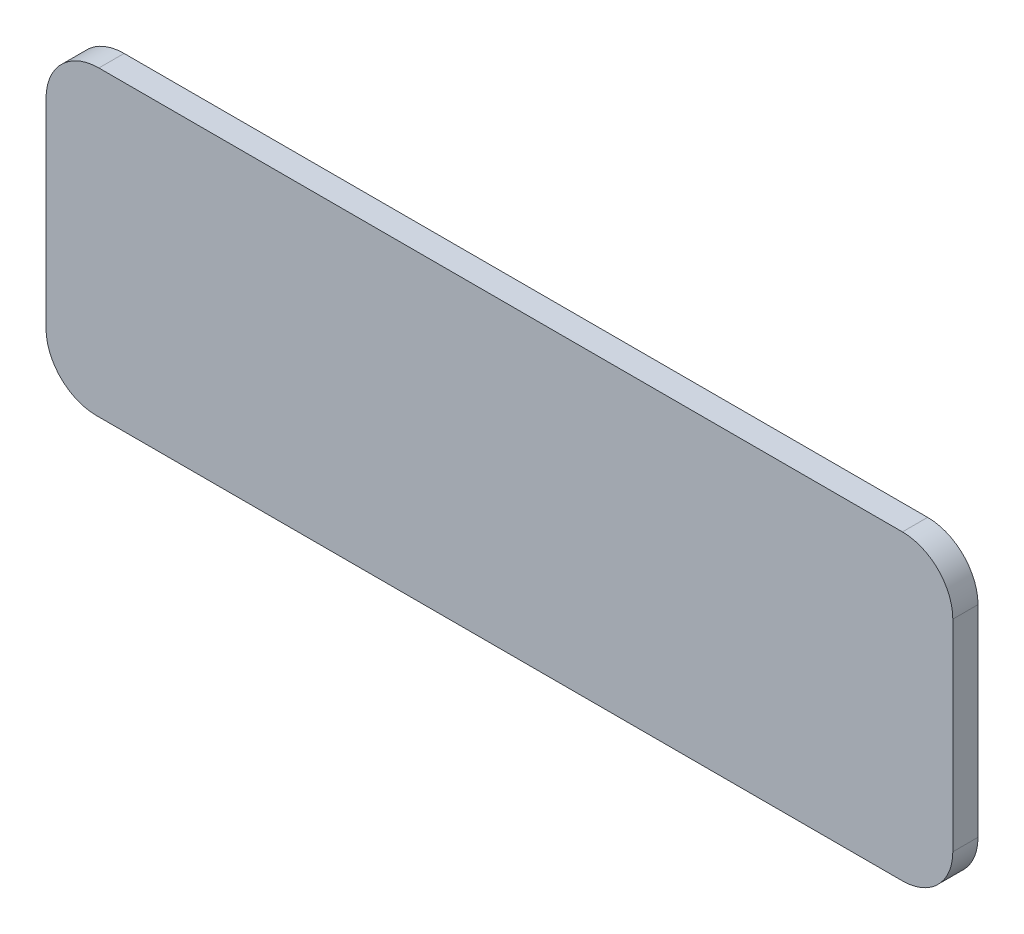
ISO-10303-21;
HEADER;
FILE_DESCRIPTION(('STEP AP214'),'2;1');
FILE_NAME('part.step','',(''),(''),'','','');
FILE_SCHEMA(('AUTOMOTIVE_DESIGN { 1 0 10303 214 1 1 1 1 }'));
ENDSEC;
DATA;
#1=APPLICATION_CONTEXT('core data for automotive mechanical design processes');
#2=APPLICATION_PROTOCOL_DEFINITION('international standard','automotive_design',2000,#1);
#3=PRODUCT_CONTEXT('',#1,'mechanical');
#4=PRODUCT('Part','Part','',(#3));
#5=PRODUCT_RELATED_PRODUCT_CATEGORY('part','',(#4));
#6=PRODUCT_DEFINITION_FORMATION('','',#4);
#7=PRODUCT_DEFINITION_CONTEXT('part definition',#1,'design');
#8=PRODUCT_DEFINITION('design','',#6,#7);
#9=PRODUCT_DEFINITION_SHAPE('','',#8);
#10=(LENGTH_UNIT() NAMED_UNIT(*) SI_UNIT(.MILLI.,.METRE.));
#11=(NAMED_UNIT(*) PLANE_ANGLE_UNIT() SI_UNIT($,.RADIAN.));
#12=(NAMED_UNIT(*) SI_UNIT($,.STERADIAN.) SOLID_ANGLE_UNIT());
#13=UNCERTAINTY_MEASURE_WITH_UNIT(LENGTH_MEASURE(1.E-05),#10,'distance_accuracy_value','');
#14=(GEOMETRIC_REPRESENTATION_CONTEXT(3) GLOBAL_UNCERTAINTY_ASSIGNED_CONTEXT((#13)) GLOBAL_UNIT_ASSIGNED_CONTEXT((#10,
#11,#12)) REPRESENTATION_CONTEXT('',''));
#15=CARTESIAN_POINT('',(0.,0.,0.));
#16=DIRECTION('',(0.,0.,1.));
#17=DIRECTION('',(1.,0.,0.));
#18=AXIS2_PLACEMENT_3D('',#15,#16,#17);
#19=CARTESIAN_POINT('',(2.1,9.9,1.));
#20=DIRECTION('',(0.,0.,-1.));
#21=DIRECTION('',(-1.,0.,0.));
#22=AXIS2_PLACEMENT_3D('',#19,#20,#21);
#23=CYLINDRICAL_SURFACE('',#22,2.1);
#24=CARTESIAN_POINT('',(2.1,9.9,0.));
#25=DIRECTION('',(0.,0.,1.));
#26=DIRECTION('',(-1.,0.,0.));
#27=AXIS2_PLACEMENT_3D('',#24,#25,#26);
#28=CIRCLE('',#27,2.1);
#29=CARTESIAN_POINT('',(2.10000000000002,12.,0.));
#30=VERTEX_POINT('',#29);
#31=CARTESIAN_POINT('',(0.,9.89999999999998,0.));
#32=VERTEX_POINT('',#31);
#33=EDGE_CURVE('E132',#30,#32,#28,.T.);
#34=ORIENTED_EDGE('',*,*,#33,.T.);
#35=DIRECTION('',(0.,0.,-1.));
#36=VECTOR('',#35,1.);
#37=CARTESIAN_POINT('',(0.,9.89999999999998,1.));
#38=LINE('',#37,#36);
#39=CARTESIAN_POINT('',(0.,9.89999999999998,1.));
#40=VERTEX_POINT('',#39);
#41=EDGE_CURVE('E11',#40,#32,#38,.T.);
#42=ORIENTED_EDGE('',*,*,#41,.F.);
#43=CARTESIAN_POINT('',(2.1,9.9,1.));
#44=DIRECTION('',(0.,0.,1.));
#45=DIRECTION('',(-1.,0.,0.));
#46=AXIS2_PLACEMENT_3D('',#43,#44,#45);
#47=CIRCLE('',#46,2.1);
#48=CARTESIAN_POINT('',(2.10000000000002,12.,1.));
#49=VERTEX_POINT('',#48);
#50=EDGE_CURVE('E146',#49,#40,#47,.T.);
#51=ORIENTED_EDGE('',*,*,#50,.F.);
#52=DIRECTION('',(0.,0.,-1.));
#53=VECTOR('',#52,1.);
#54=CARTESIAN_POINT('',(2.10000000000002,12.,1.));
#55=LINE('',#54,#53);
#56=EDGE_CURVE('E128',#49,#30,#55,.T.);
#57=ORIENTED_EDGE('',*,*,#56,.T.);
#58=EDGE_LOOP('',(#34,#42,#51,#57));
#59=FACE_BOUND('',#58,.T.);
#60=ADVANCED_FACE('F36',(#59),#23,.T.);
#61=CARTESIAN_POINT('',(0.,2.,1.));
#62=DIRECTION('',(1.,0.,0.));
#63=DIRECTION('',(0.,0.,-1.));
#64=AXIS2_PLACEMENT_3D('',#61,#62,#63);
#65=PLANE('',#64);
#66=DIRECTION('',(0.,-1.,0.));
#67=VECTOR('',#66,1.);
#68=CARTESIAN_POINT('',(0.,2.,0.));
#69=LINE('',#68,#67);
#70=CARTESIAN_POINT('',(0.,2.,0.));
#71=VERTEX_POINT('',#70);
#72=EDGE_CURVE('E135',#32,#71,#69,.T.);
#73=ORIENTED_EDGE('',*,*,#72,.T.);
#74=DIRECTION('',(0.,0.,-1.));
#75=VECTOR('',#74,1.);
#76=CARTESIAN_POINT('',(0.,2.,1.));
#77=LINE('',#76,#75);
#78=CARTESIAN_POINT('',(0.,2.,1.));
#79=VERTEX_POINT('',#78);
#80=EDGE_CURVE('E44',#79,#71,#77,.T.);
#81=ORIENTED_EDGE('',*,*,#80,.F.);
#82=DIRECTION('',(0.,-1.,0.));
#83=VECTOR('',#82,1.);
#84=CARTESIAN_POINT('',(0.,2.,1.));
#85=LINE('',#84,#83);
#86=EDGE_CURVE('E95',#40,#79,#85,.T.);
#87=ORIENTED_EDGE('',*,*,#86,.F.);
#88=ORIENTED_EDGE('',*,*,#41,.T.);
#89=EDGE_LOOP('',(#73,#81,#87,#88));
#90=FACE_BOUND('',#89,.T.);
#91=ADVANCED_FACE('F181',(#90),#65,.F.);
#92=CARTESIAN_POINT('',(2.,2.,1.));
#93=DIRECTION('',(0.,0.,-1.));
#94=DIRECTION('',(-1.,0.,0.));
#95=AXIS2_PLACEMENT_3D('',#92,#93,#94);
#96=CYLINDRICAL_SURFACE('',#95,2.);
#97=CARTESIAN_POINT('',(2.,2.,0.));
#98=DIRECTION('',(0.,0.,1.));
#99=DIRECTION('',(1.,0.,0.));
#100=AXIS2_PLACEMENT_3D('',#97,#98,#99);
#101=CIRCLE('',#100,2.);
#102=CARTESIAN_POINT('',(2.,0.,0.));
#103=VERTEX_POINT('',#102);
#104=EDGE_CURVE('E137',#71,#103,#101,.T.);
#105=ORIENTED_EDGE('',*,*,#104,.T.);
#106=DIRECTION('',(0.,0.,-1.));
#107=VECTOR('',#106,1.);
#108=CARTESIAN_POINT('',(2.,0.,1.));
#109=LINE('',#108,#107);
#110=CARTESIAN_POINT('',(2.,0.,1.));
#111=VERTEX_POINT('',#110);
#112=EDGE_CURVE('E153',#111,#103,#109,.T.);
#113=ORIENTED_EDGE('',*,*,#112,.F.);
#114=CARTESIAN_POINT('',(2.,2.,1.));
#115=DIRECTION('',(0.,0.,1.));
#116=DIRECTION('',(1.,0.,0.));
#117=AXIS2_PLACEMENT_3D('',#114,#115,#116);
#118=CIRCLE('',#117,2.);
#119=EDGE_CURVE('E161',#79,#111,#118,.T.);
#120=ORIENTED_EDGE('',*,*,#119,.F.);
#121=ORIENTED_EDGE('',*,*,#80,.T.);
#122=EDGE_LOOP('',(#105,#113,#120,#121));
#123=FACE_BOUND('',#122,.T.);
#124=ADVANCED_FACE('F159',(#123),#96,.T.);
#125=CARTESIAN_POINT('',(2.,0.,1.));
#126=DIRECTION('',(0.,1.,0.));
#127=DIRECTION('',(0.,0.,1.));
#128=AXIS2_PLACEMENT_3D('',#125,#126,#127);
#129=PLANE('',#128);
#130=DIRECTION('',(1.,0.,0.));
#131=VECTOR('',#130,1.);
#132=CARTESIAN_POINT('',(2.,0.,0.));
#133=LINE('',#132,#131);
#134=CARTESIAN_POINT('',(34.,0.,0.));
#135=VERTEX_POINT('',#134);
#136=EDGE_CURVE('E139',#103,#135,#133,.T.);
#137=ORIENTED_EDGE('',*,*,#136,.T.);
#138=DIRECTION('',(0.,0.,-1.));
#139=VECTOR('',#138,1.);
#140=CARTESIAN_POINT('',(34.,0.,1.));
#141=LINE('',#140,#139);
#142=CARTESIAN_POINT('',(34.,0.,1.));
#143=VERTEX_POINT('',#142);
#144=EDGE_CURVE('E150',#143,#135,#141,.T.);
#145=ORIENTED_EDGE('',*,*,#144,.F.);
#146=DIRECTION('',(1.,0.,0.));
#147=VECTOR('',#146,1.);
#148=CARTESIAN_POINT('',(2.,0.,1.));
#149=LINE('',#148,#147);
#150=EDGE_CURVE('E173',#111,#143,#149,.T.);
#151=ORIENTED_EDGE('',*,*,#150,.F.);
#152=ORIENTED_EDGE('',*,*,#112,.T.);
#153=EDGE_LOOP('',(#137,#145,#151,#152));
#154=FACE_BOUND('',#153,.T.);
#155=ADVANCED_FACE('F169',(#154),#129,.F.);
#156=CARTESIAN_POINT('',(34.,2.,1.));
#157=DIRECTION('',(0.,0.,-1.));
#158=DIRECTION('',(-1.,0.,0.));
#159=AXIS2_PLACEMENT_3D('',#156,#157,#158);
#160=CYLINDRICAL_SURFACE('',#159,2.);
#161=CARTESIAN_POINT('',(34.,2.,0.));
#162=DIRECTION('',(0.,0.,1.));
#163=DIRECTION('',(-1.,0.,0.));
#164=AXIS2_PLACEMENT_3D('',#161,#162,#163);
#165=CIRCLE('',#164,2.);
#166=CARTESIAN_POINT('',(36.,2.,0.));
#167=VERTEX_POINT('',#166);
#168=EDGE_CURVE('E141',#135,#167,#165,.T.);
#169=ORIENTED_EDGE('',*,*,#168,.T.);
#170=DIRECTION('',(0.,0.,-1.));
#171=VECTOR('',#170,1.);
#172=CARTESIAN_POINT('',(36.,2.,1.));
#173=LINE('',#172,#171);
#174=CARTESIAN_POINT('',(36.,2.,1.));
#175=VERTEX_POINT('',#174);
#176=EDGE_CURVE('E123',#175,#167,#173,.T.);
#177=ORIENTED_EDGE('',*,*,#176,.F.);
#178=CARTESIAN_POINT('',(34.,2.,1.));
#179=DIRECTION('',(0.,0.,1.));
#180=DIRECTION('',(-1.,0.,0.));
#181=AXIS2_PLACEMENT_3D('',#178,#179,#180);
#182=CIRCLE('',#181,2.);
#183=EDGE_CURVE('E114',#143,#175,#182,.T.);
#184=ORIENTED_EDGE('',*,*,#183,.F.);
#185=ORIENTED_EDGE('',*,*,#144,.T.);
#186=EDGE_LOOP('',(#169,#177,#184,#185));
#187=FACE_BOUND('',#186,.T.);
#188=ADVANCED_FACE('F172',(#187),#160,.T.);
#189=CARTESIAN_POINT('',(36.,2.,1.));
#190=DIRECTION('',(-1.,0.,0.));
#191=DIRECTION('',(0.,-1.,0.));
#192=AXIS2_PLACEMENT_3D('',#189,#190,#191);
#193=PLANE('',#192);
#194=DIRECTION('',(0.,1.,0.));
#195=VECTOR('',#194,1.);
#196=CARTESIAN_POINT('',(36.,2.,0.));
#197=LINE('',#196,#195);
#198=CARTESIAN_POINT('',(36.,10.,0.));
#199=VERTEX_POINT('',#198);
#200=EDGE_CURVE('E122',#167,#199,#197,.T.);
#201=ORIENTED_EDGE('',*,*,#200,.T.);
#202=DIRECTION('',(0.,0.,-1.));
#203=VECTOR('',#202,1.);
#204=CARTESIAN_POINT('',(36.,10.,1.));
#205=LINE('',#204,#203);
#206=CARTESIAN_POINT('',(36.,10.,1.));
#207=VERTEX_POINT('',#206);
#208=EDGE_CURVE('E119',#207,#199,#205,.T.);
#209=ORIENTED_EDGE('',*,*,#208,.F.);
#210=DIRECTION('',(0.,1.,0.));
#211=VECTOR('',#210,1.);
#212=CARTESIAN_POINT('',(36.,2.,1.));
#213=LINE('',#212,#211);
#214=EDGE_CURVE('E108',#175,#207,#213,.T.);
#215=ORIENTED_EDGE('',*,*,#214,.F.);
#216=ORIENTED_EDGE('',*,*,#176,.T.);
#217=EDGE_LOOP('',(#201,#209,#215,#216));
#218=FACE_BOUND('',#217,.T.);
#219=ADVANCED_FACE('F120',(#218),#193,.F.);
#220=CARTESIAN_POINT('',(34.,10.,1.));
#221=DIRECTION('',(0.,0.,-1.));
#222=DIRECTION('',(-1.,0.,0.));
#223=AXIS2_PLACEMENT_3D('',#220,#221,#222);
#224=CYLINDRICAL_SURFACE('',#223,2.);
#225=CARTESIAN_POINT('',(34.,10.,0.));
#226=DIRECTION('',(0.,0.,1.));
#227=DIRECTION('',(-1.,0.,0.));
#228=AXIS2_PLACEMENT_3D('',#225,#226,#227);
#229=CIRCLE('',#228,2.);
#230=CARTESIAN_POINT('',(34.,12.,0.));
#231=VERTEX_POINT('',#230);
#232=EDGE_CURVE('E81',#199,#231,#229,.T.);
#233=ORIENTED_EDGE('',*,*,#232,.T.);
#234=DIRECTION('',(0.,0.,-1.));
#235=VECTOR('',#234,1.);
#236=CARTESIAN_POINT('',(34.,12.,1.));
#237=LINE('',#236,#235);
#238=CARTESIAN_POINT('',(34.,12.,1.));
#239=VERTEX_POINT('',#238);
#240=EDGE_CURVE('E124',#239,#231,#237,.T.);
#241=ORIENTED_EDGE('',*,*,#240,.F.);
#242=CARTESIAN_POINT('',(34.,10.,1.));
#243=DIRECTION('',(0.,0.,1.));
#244=DIRECTION('',(-1.,0.,0.));
#245=AXIS2_PLACEMENT_3D('',#242,#243,#244);
#246=CIRCLE('',#245,2.);
#247=EDGE_CURVE('E112',#207,#239,#246,.T.);
#248=ORIENTED_EDGE('',*,*,#247,.F.);
#249=ORIENTED_EDGE('',*,*,#208,.T.);
#250=EDGE_LOOP('',(#233,#241,#248,#249));
#251=FACE_BOUND('',#250,.T.);
#252=ADVANCED_FACE('F126',(#251),#224,.T.);
#253=CARTESIAN_POINT('',(2.10000000000002,12.,1.));
#254=DIRECTION('',(0.,-1.,0.));
#255=DIRECTION('',(0.,0.,-1.));
#256=AXIS2_PLACEMENT_3D('',#253,#254,#255);
#257=PLANE('',#256);
#258=DIRECTION('',(-1.,0.,0.));
#259=VECTOR('',#258,1.);
#260=CARTESIAN_POINT('',(2.10000000000002,12.,0.));
#261=LINE('',#260,#259);
#262=EDGE_CURVE('E87',#231,#30,#261,.T.);
#263=ORIENTED_EDGE('',*,*,#262,.T.);
#264=ORIENTED_EDGE('',*,*,#56,.F.);
#265=DIRECTION('',(-1.,0.,0.));
#266=VECTOR('',#265,1.);
#267=CARTESIAN_POINT('',(2.10000000000002,12.,1.));
#268=LINE('',#267,#266);
#269=EDGE_CURVE('E52',#239,#49,#268,.T.);
#270=ORIENTED_EDGE('',*,*,#269,.F.);
#271=ORIENTED_EDGE('',*,*,#240,.T.);
#272=EDGE_LOOP('',(#263,#264,#270,#271));
#273=FACE_BOUND('',#272,.T.);
#274=ADVANCED_FACE('F197',(#273),#257,.F.);
#275=CARTESIAN_POINT('',(2.1,9.9,1.));
#276=DIRECTION('',(0.,0.,-1.));
#277=DIRECTION('',(-1.,0.,0.));
#278=AXIS2_PLACEMENT_3D('',#275,#276,#277);
#279=PLANE('',#278);
#280=ORIENTED_EDGE('',*,*,#50,.T.);
#281=ORIENTED_EDGE('',*,*,#86,.T.);
#282=ORIENTED_EDGE('',*,*,#119,.T.);
#283=ORIENTED_EDGE('',*,*,#150,.T.);
#284=ORIENTED_EDGE('',*,*,#183,.T.);
#285=ORIENTED_EDGE('',*,*,#214,.T.);
#286=ORIENTED_EDGE('',*,*,#247,.T.);
#287=ORIENTED_EDGE('',*,*,#269,.T.);
#288=EDGE_LOOP('',(#280,#281,#282,#283,#284,#285,#286,#287));
#289=FACE_BOUND('',#288,.T.);
#290=ADVANCED_FACE('F110',(#289),#279,.F.);
#291=CARTESIAN_POINT('',(2.1,9.9,0.));
#292=DIRECTION('',(0.,0.,-1.));
#293=DIRECTION('',(-1.,0.,0.));
#294=AXIS2_PLACEMENT_3D('',#291,#292,#293);
#295=PLANE('',#294);
#296=ORIENTED_EDGE('',*,*,#33,.F.);
#297=ORIENTED_EDGE('',*,*,#262,.F.);
#298=ORIENTED_EDGE('',*,*,#232,.F.);
#299=ORIENTED_EDGE('',*,*,#200,.F.);
#300=ORIENTED_EDGE('',*,*,#168,.F.);
#301=ORIENTED_EDGE('',*,*,#136,.F.);
#302=ORIENTED_EDGE('',*,*,#104,.F.);
#303=ORIENTED_EDGE('',*,*,#72,.F.);
#304=EDGE_LOOP('',(#296,#297,#298,#299,#300,#301,#302,#303));
#305=FACE_BOUND('',#304,.T.);
#306=ADVANCED_FACE('F165',(#305),#295,.T.);
#307=CLOSED_SHELL('',(#60,#91,#124,#155,#188,#219,#252,#274,#290,#306));
#308=MANIFOLD_SOLID_BREP('B2',#307);
#309=ADVANCED_BREP_SHAPE_REPRESENTATION('',(#18,#308),#14);
#310=SHAPE_DEFINITION_REPRESENTATION(#9,#309);
ENDSEC;
END-ISO-10303-21;
